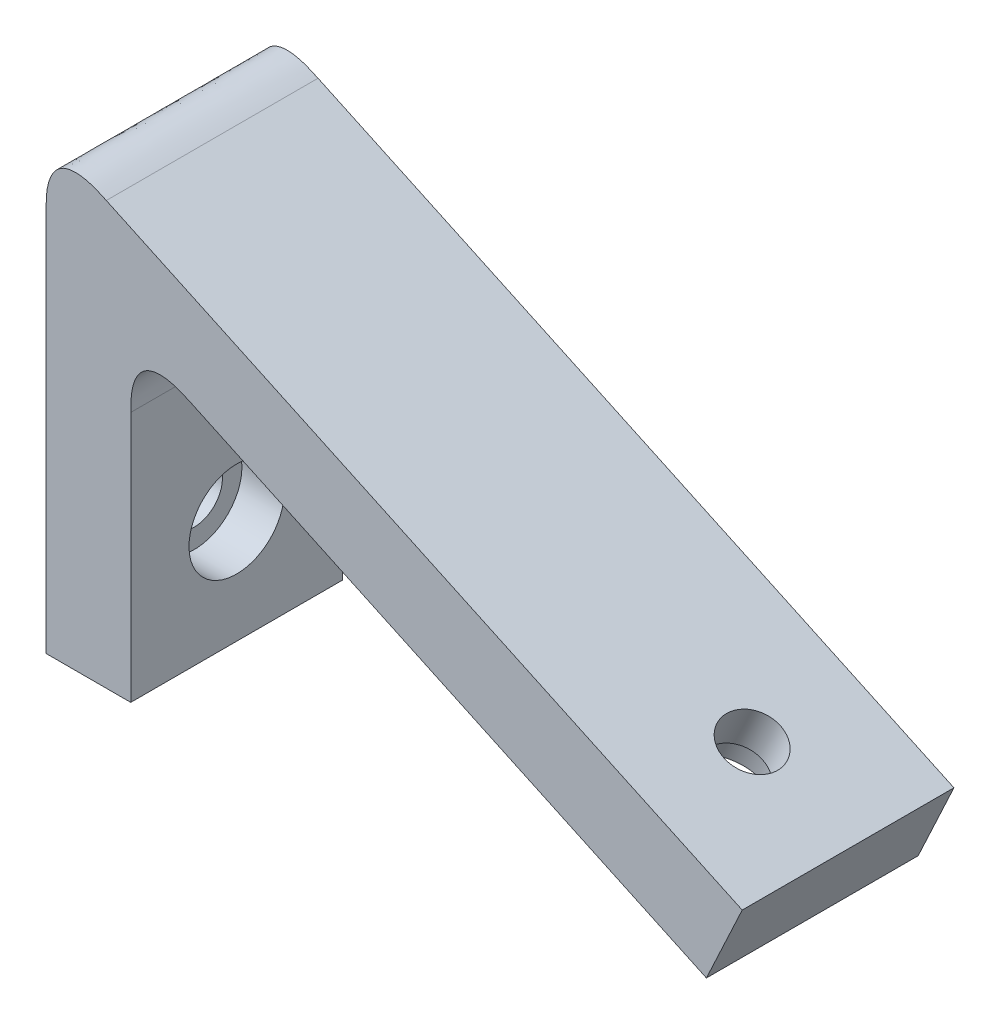
ISO-10303-21;
HEADER;
FILE_DESCRIPTION(('STEP AP214'),'2;1');
FILE_NAME('part.step','',(''),(''),'','','');
FILE_SCHEMA(('AUTOMOTIVE_DESIGN { 1 0 10303 214 1 1 1 1 }'));
ENDSEC;
DATA;
#1=APPLICATION_CONTEXT('core data for automotive mechanical design processes');
#2=APPLICATION_PROTOCOL_DEFINITION('international standard','automotive_design',2000,#1);
#3=PRODUCT_CONTEXT('',#1,'mechanical');
#4=PRODUCT('Part','Part','',(#3));
#5=PRODUCT_RELATED_PRODUCT_CATEGORY('part','',(#4));
#6=PRODUCT_DEFINITION_FORMATION('','',#4);
#7=PRODUCT_DEFINITION_CONTEXT('part definition',#1,'design');
#8=PRODUCT_DEFINITION('design','',#6,#7);
#9=PRODUCT_DEFINITION_SHAPE('','',#8);
#10=(LENGTH_UNIT() NAMED_UNIT(*) SI_UNIT(.MILLI.,.METRE.));
#11=(NAMED_UNIT(*) PLANE_ANGLE_UNIT() SI_UNIT($,.RADIAN.));
#12=(NAMED_UNIT(*) SI_UNIT($,.STERADIAN.) SOLID_ANGLE_UNIT());
#13=UNCERTAINTY_MEASURE_WITH_UNIT(LENGTH_MEASURE(1.E-05),#10,'distance_accuracy_value','');
#14=(GEOMETRIC_REPRESENTATION_CONTEXT(3) GLOBAL_UNCERTAINTY_ASSIGNED_CONTEXT((#13)) GLOBAL_UNIT_ASSIGNED_CONTEXT((#10,
#11,#12)) REPRESENTATION_CONTEXT('',''));
#15=CARTESIAN_POINT('',(0.,0.,0.));
#16=DIRECTION('',(0.,0.,1.));
#17=DIRECTION('',(1.,0.,0.));
#18=AXIS2_PLACEMENT_3D('',#15,#16,#17);
#19=CARTESIAN_POINT('',(0.,12.7,12.7));
#20=DIRECTION('',(-1.,0.,0.));
#21=DIRECTION('',(0.,0.,1.));
#22=AXIS2_PLACEMENT_3D('',#19,#20,#21);
#23=CYLINDRICAL_SURFACE('',#22,3.37819999999999);
#24=CARTESIAN_POINT('',(0.,12.7,12.7));
#25=DIRECTION('',(-1.,0.,0.));
#26=DIRECTION('',(0.,0.,1.));
#27=AXIS2_PLACEMENT_3D('',#24,#25,#26);
#28=CIRCLE('',#27,3.37819999999999);
#29=CARTESIAN_POINT('',(0.,12.7,16.0782));
#30=VERTEX_POINT('',#29);
#31=EDGE_CURVE('E142',#30,#30,#28,.T.);
#32=ORIENTED_EDGE('',*,*,#31,.T.);
#33=EDGE_LOOP('',(#32));
#34=FACE_BOUND('',#33,.T.);
#35=CARTESIAN_POINT('',(5.08,12.7,12.7));
#36=DIRECTION('',(1.,0.,0.));
#37=DIRECTION('',(0.,1.,0.));
#38=AXIS2_PLACEMENT_3D('',#35,#36,#37);
#39=CIRCLE('',#38,3.37819999999999);
#40=CARTESIAN_POINT('',(5.08,16.0782,12.7));
#41=VERTEX_POINT('',#40);
#42=EDGE_CURVE('E51',#41,#41,#39,.F.);
#43=ORIENTED_EDGE('',*,*,#42,.F.);
#44=EDGE_LOOP('',(#43));
#45=FACE_BOUND('',#44,.T.);
#46=ADVANCED_FACE('F43',(#34,#45),#23,.F.);
#47=CARTESIAN_POINT('',(72.0043460161127,20.4718274957577,12.7));
#48=DIRECTION('',(0.422618261740703,0.906307787036648,0.));
#49=DIRECTION('',(-0.906307787036648,0.422618261740703,0.));
#50=AXIS2_PLACEMENT_3D('',#47,#48,#49);
#51=CYLINDRICAL_SURFACE('',#50,3.37819999999999);
#52=CARTESIAN_POINT('',(72.0043460161127,20.4718274957577,12.7));
#53=DIRECTION('',(0.422618261740703,0.906307787036648,0.));
#54=DIRECTION('',(-0.906307787036648,0.422618261740703,0.));
#55=AXIS2_PLACEMENT_3D('',#52,#53,#54);
#56=CIRCLE('',#55,3.37819999999999);
#57=CARTESIAN_POINT('',(68.9426570499455,21.8995165075701,12.7));
#58=VERTEX_POINT('',#57);
#59=EDGE_CURVE('E285',#58,#58,#56,.T.);
#60=ORIENTED_EDGE('',*,*,#59,.T.);
#61=EDGE_LOOP('',(#60));
#62=FACE_BOUND('',#61,.T.);
#63=CARTESIAN_POINT('',(69.85744524647,15.8677839376115,12.7));
#64=DIRECTION('',(-0.422618261740704,-0.906307787036648,0.));
#65=DIRECTION('',(0.906307787036648,-0.422618261740704,0.));
#66=AXIS2_PLACEMENT_3D('',#63,#64,#65);
#67=CIRCLE('',#66,3.37819999999999);
#68=CARTESIAN_POINT('',(72.9191342126372,14.4400949257991,12.7));
#69=VERTEX_POINT('',#68);
#70=EDGE_CURVE('E278',#69,#69,#67,.F.);
#71=ORIENTED_EDGE('',*,*,#70,.F.);
#72=EDGE_LOOP('',(#71));
#73=FACE_BOUND('',#72,.T.);
#74=ADVANCED_FACE('F311',(#62,#73),#51,.F.);
#75=CARTESIAN_POINT('',(0.,0.,25.4));
#76=DIRECTION('',(0.,-1.,0.));
#77=DIRECTION('',(1.,0.,0.));
#78=AXIS2_PLACEMENT_3D('',#75,#76,#77);
#79=PLANE('',#78);
#80=DIRECTION('',(-1.,0.,0.));
#81=VECTOR('',#80,1.);
#82=CARTESIAN_POINT('',(0.,0.,0.));
#83=LINE('',#82,#81);
#84=CARTESIAN_POINT('',(10.16,0.,0.));
#85=VERTEX_POINT('',#84);
#86=CARTESIAN_POINT('',(0.,0.,0.));
#87=VERTEX_POINT('',#86);
#88=EDGE_CURVE('E127',#85,#87,#83,.T.);
#89=ORIENTED_EDGE('',*,*,#88,.F.);
#90=DIRECTION('',(0.,0.,-1.));
#91=VECTOR('',#90,1.);
#92=CARTESIAN_POINT('',(10.16,0.,25.4));
#93=LINE('',#92,#91);
#94=CARTESIAN_POINT('',(10.16,0.,25.4));
#95=VERTEX_POINT('',#94);
#96=EDGE_CURVE('E116',#95,#85,#93,.T.);
#97=ORIENTED_EDGE('',*,*,#96,.F.);
#98=DIRECTION('',(-1.,0.,0.));
#99=VECTOR('',#98,1.);
#100=CARTESIAN_POINT('',(0.,0.,25.4));
#101=LINE('',#100,#99);
#102=CARTESIAN_POINT('',(0.,0.,25.4));
#103=VERTEX_POINT('',#102);
#104=EDGE_CURVE('E120',#95,#103,#101,.T.);
#105=ORIENTED_EDGE('',*,*,#104,.T.);
#106=DIRECTION('',(0.,0.,-1.));
#107=VECTOR('',#106,1.);
#108=CARTESIAN_POINT('',(0.,0.,25.4));
#109=LINE('',#108,#107);
#110=EDGE_CURVE('E365',#103,#87,#109,.T.);
#111=ORIENTED_EDGE('',*,*,#110,.T.);
#112=EDGE_LOOP('',(#89,#97,#105,#111));
#113=FACE_BOUND('',#112,.T.);
#114=ADVANCED_FACE('F124',(#113),#79,.T.);
#115=CARTESIAN_POINT('',(10.16,0.,25.4));
#116=DIRECTION('',(1.,0.,0.));
#117=DIRECTION('',(0.,1.,0.));
#118=AXIS2_PLACEMENT_3D('',#115,#116,#117);
#119=PLANE('',#118);
#120=CARTESIAN_POINT('',(10.16,12.7,12.7));
#121=DIRECTION('',(1.,0.,0.));
#122=DIRECTION('',(0.,1.,0.));
#123=AXIS2_PLACEMENT_3D('',#120,#121,#122);
#124=CIRCLE('',#123,5.715);
#125=CARTESIAN_POINT('',(10.16,18.415,12.7));
#126=VERTEX_POINT('',#125);
#127=EDGE_CURVE('E298',#126,#126,#124,.T.);
#128=ORIENTED_EDGE('',*,*,#127,.F.);
#129=EDGE_LOOP('',(#128));
#130=FACE_BOUND('',#129,.T.);
#131=DIRECTION('',(0.,-1.,0.));
#132=VECTOR('',#131,1.);
#133=CARTESIAN_POINT('',(10.16,0.,0.));
#134=LINE('',#133,#132);
#135=CARTESIAN_POINT('',(10.16,30.1259972682431,0.));
#136=VERTEX_POINT('',#135);
#137=EDGE_CURVE('E322',#136,#85,#134,.T.);
#138=ORIENTED_EDGE('',*,*,#137,.F.);
#139=CARTESIAN_POINT('',(10.16,30.1259972682431,26.67));
#140=CARTESIAN_POINT('',(10.16,30.1259972682431,17.3566666666566));
#141=CARTESIAN_POINT('',(10.16,30.1259972682431,8.04333333333333));
#142=CARTESIAN_POINT('',(10.16,30.1259972682431,-1.27));
#143=B_SPLINE_CURVE_WITH_KNOTS('',3,(#139,#140,#141,#142),.UNSPECIFIED.,.F.,.F.,(4,4),(-0.02667,
0.00127),.UNSPECIFIED.);
#144=CARTESIAN_POINT('',(10.16,30.1259972682431,25.4));
#145=VERTEX_POINT('',#144);
#146=EDGE_CURVE('E70',#136,#145,#143,.F.);
#147=ORIENTED_EDGE('',*,*,#146,.T.);
#148=DIRECTION('',(0.,-1.,0.));
#149=VECTOR('',#148,1.);
#150=CARTESIAN_POINT('',(10.16,0.,25.4));
#151=LINE('',#150,#149);
#152=EDGE_CURVE('E113',#145,#95,#151,.T.);
#153=ORIENTED_EDGE('',*,*,#152,.T.);
#154=ORIENTED_EDGE('',*,*,#96,.T.);
#155=EDGE_LOOP('',(#138,#147,#153,#154));
#156=FACE_BOUND('',#155,.T.);
#157=ADVANCED_FACE('F115',(#130,#156),#119,.T.);
#158=CARTESIAN_POINT('',(16.4077855842091,35.1866097355729,25.4));
#159=DIRECTION('',(-0.422618261740704,-0.906307787036648,0.));
#160=DIRECTION('',(0.906307787036648,-0.422618261740704,0.));
#161=AXIS2_PLACEMENT_3D('',#158,#159,#160);
#162=PLANE('',#161);
#163=CARTESIAN_POINT('',(67.7105444768272,11.2637403794653,12.7));
#164=DIRECTION('',(-0.422618261740704,-0.906307787036648,0.));
#165=DIRECTION('',(0.906307787036648,-0.422618261740704,0.));
#166=AXIS2_PLACEMENT_3D('',#163,#164,#165);
#167=CIRCLE('',#166,5.715);
#168=CARTESIAN_POINT('',(72.8900934797416,8.84847701361721,12.7));
#169=VERTEX_POINT('',#168);
#170=EDGE_CURVE('E291',#169,#169,#167,.T.);
#171=ORIENTED_EDGE('',*,*,#170,.F.);
#172=EDGE_LOOP('',(#171));
#173=FACE_BOUND('',#172,.T.);
#174=DIRECTION('',(-0.906307787036648,0.422618261740704,0.));
#175=VECTOR('',#174,1.);
#176=CARTESIAN_POINT('',(16.4077855842091,35.1866097355729,25.4));
#177=LINE('',#176,#175);
#178=CARTESIAN_POINT('',(79.2206533721926,5.89648845535838,25.4));
#179=VERTEX_POINT('',#178);
#180=CARTESIAN_POINT('',(17.3869007696428,34.7300408263893,25.4));
#181=VERTEX_POINT('',#180);
#182=EDGE_CURVE('E119',#179,#181,#177,.T.);
#183=ORIENTED_EDGE('',*,*,#182,.T.);
#184=CARTESIAN_POINT('',(17.3869007696428,34.7300408263893,-1.27));
#185=CARTESIAN_POINT('',(17.3869007696428,34.7300408263893,8.04333333333333));
#186=CARTESIAN_POINT('',(17.3869007696428,34.7300408263893,17.3566666666566));
#187=CARTESIAN_POINT('',(17.3869007696428,34.7300408263893,26.67));
#188=B_SPLINE_CURVE_WITH_KNOTS('',3,(#184,#185,#186,#187),.UNSPECIFIED.,.F.,.F.,(4,4),(-0.02667,
0.00127),.UNSPECIFIED.);
#189=CARTESIAN_POINT('',(17.3869007696428,34.7300408263893,0.));
#190=VERTEX_POINT('',#189);
#191=EDGE_CURVE('E257',#181,#190,#188,.F.);
#192=ORIENTED_EDGE('',*,*,#191,.T.);
#193=DIRECTION('',(-0.906307787036648,0.422618261740704,0.));
#194=VECTOR('',#193,1.);
#195=CARTESIAN_POINT('',(16.4077855842091,35.1866097355729,0.));
#196=LINE('',#195,#194);
#197=CARTESIAN_POINT('',(79.2206533721926,5.89648845535838,0.));
#198=VERTEX_POINT('',#197);
#199=EDGE_CURVE('E326',#198,#190,#196,.T.);
#200=ORIENTED_EDGE('',*,*,#199,.F.);
#201=DIRECTION('',(0.,0.,-1.));
#202=VECTOR('',#201,1.);
#203=CARTESIAN_POINT('',(79.2206533721926,5.89648845535838,25.4));
#204=LINE('',#203,#202);
#205=EDGE_CURVE('E129',#179,#198,#204,.T.);
#206=ORIENTED_EDGE('',*,*,#205,.F.);
#207=EDGE_LOOP('',(#183,#192,#200,#206));
#208=FACE_BOUND('',#207,.T.);
#209=ADVANCED_FACE('F361',(#173,#208),#162,.T.);
#210=CARTESIAN_POINT('',(62.8128677879834,-29.2901212802145,25.4));
#211=DIRECTION('',(0.906307787036647,-0.422618261740705,0.));
#212=DIRECTION('',(0.422618261740705,0.906307787036648,0.));
#213=AXIS2_PLACEMENT_3D('',#210,#211,#212);
#214=PLANE('',#213);
#215=DIRECTION('',(-0.422618261740705,-0.906307787036648,0.));
#216=VECTOR('',#215,1.);
#217=CARTESIAN_POINT('',(62.8128677879834,-29.2901212802145,0.));
#218=LINE('',#217,#216);
#219=CARTESIAN_POINT('',(83.5144549114781,15.1045755716507,0.));
#220=VERTEX_POINT('',#219);
#221=EDGE_CURVE('E421',#220,#198,#218,.T.);
#222=ORIENTED_EDGE('',*,*,#221,.F.);
#223=DIRECTION('',(0.,0.,-1.));
#224=VECTOR('',#223,1.);
#225=CARTESIAN_POINT('',(83.5144549114781,15.1045755716507,25.4));
#226=LINE('',#225,#224);
#227=CARTESIAN_POINT('',(83.5144549114781,15.1045755716507,25.4));
#228=VERTEX_POINT('',#227);
#229=EDGE_CURVE('E359',#228,#220,#226,.T.);
#230=ORIENTED_EDGE('',*,*,#229,.F.);
#231=DIRECTION('',(-0.422618261740705,-0.906307787036648,0.));
#232=VECTOR('',#231,1.);
#233=CARTESIAN_POINT('',(62.8128677879834,-29.2901212802145,25.4));
#234=LINE('',#233,#232);
#235=EDGE_CURVE('E155',#228,#179,#234,.T.);
#236=ORIENTED_EDGE('',*,*,#235,.T.);
#237=ORIENTED_EDGE('',*,*,#205,.T.);
#238=EDGE_LOOP('',(#222,#230,#236,#237));
#239=FACE_BOUND('',#238,.T.);
#240=ADVANCED_FACE('F356',(#239),#214,.T.);
#241=CARTESIAN_POINT('',(20.7015871234946,44.3946968518652,25.4));
#242=DIRECTION('',(0.422618261740703,0.906307787036648,0.));
#243=DIRECTION('',(-0.906307787036648,0.422618261740703,0.));
#244=AXIS2_PLACEMENT_3D('',#241,#242,#243);
#245=PLANE('',#244);
#246=ORIENTED_EDGE('',*,*,#59,.F.);
#247=EDGE_LOOP('',(#246));
#248=FACE_BOUND('',#247,.T.);
#249=DIRECTION('',(0.906307787036648,-0.422618261740703,0.));
#250=VECTOR('',#249,1.);
#251=CARTESIAN_POINT('',(20.7015871234946,44.3946968518652,0.));
#252=LINE('',#251,#250);
#253=CARTESIAN_POINT('',(7.22690076964278,50.678046289903,0.));
#254=VERTEX_POINT('',#253);
#255=EDGE_CURVE('E138',#254,#220,#252,.T.);
#256=ORIENTED_EDGE('',*,*,#255,.F.);
#257=CARTESIAN_POINT('',(7.22690076964277,50.678046289903,26.67));
#258=CARTESIAN_POINT('',(7.22690076964277,50.678046289903,17.3566666666566));
#259=CARTESIAN_POINT('',(7.22690076964277,50.678046289903,8.04333333333334));
#260=CARTESIAN_POINT('',(7.22690076964277,50.678046289903,-1.26999999999999));
#261=B_SPLINE_CURVE_WITH_KNOTS('',3,(#257,#258,#259,#260),.UNSPECIFIED.,.F.,.F.,(4,4),(-0.00127,
0.02667),.UNSPECIFIED.);
#262=CARTESIAN_POINT('',(7.22690076964276,50.678046289903,25.4));
#263=VERTEX_POINT('',#262);
#264=EDGE_CURVE('E236',#254,#263,#261,.F.);
#265=ORIENTED_EDGE('',*,*,#264,.T.);
#266=DIRECTION('',(0.906307787036648,-0.422618261740703,0.));
#267=VECTOR('',#266,1.);
#268=CARTESIAN_POINT('',(20.7015871234946,44.3946968518652,25.4));
#269=LINE('',#268,#267);
#270=EDGE_CURVE('E344',#263,#228,#269,.T.);
#271=ORIENTED_EDGE('',*,*,#270,.T.);
#272=ORIENTED_EDGE('',*,*,#229,.T.);
#273=EDGE_LOOP('',(#256,#265,#271,#272));
#274=FACE_BOUND('',#273,.T.);
#275=ADVANCED_FACE('F407',(#248,#274),#245,.T.);
#276=CARTESIAN_POINT('',(0.,0.,25.4));
#277=DIRECTION('',(-1.,0.,0.));
#278=DIRECTION('',(0.,0.,1.));
#279=AXIS2_PLACEMENT_3D('',#276,#277,#278);
#280=PLANE('',#279);
#281=ORIENTED_EDGE('',*,*,#31,.F.);
#282=EDGE_LOOP('',(#281));
#283=FACE_BOUND('',#282,.T.);
#284=DIRECTION('',(0.,1.,0.));
#285=VECTOR('',#284,1.);
#286=CARTESIAN_POINT('',(0.,0.,25.4));
#287=LINE('',#286,#285);
#288=CARTESIAN_POINT('',(0.,46.0740027317568,25.4));
#289=VERTEX_POINT('',#288);
#290=EDGE_CURVE('E134',#103,#289,#287,.T.);
#291=ORIENTED_EDGE('',*,*,#290,.T.);
#292=CARTESIAN_POINT('',(0.,46.0740027317568,-1.26999999999999));
#293=CARTESIAN_POINT('',(0.,46.0740027317568,8.04333333333334));
#294=CARTESIAN_POINT('',(0.,46.0740027317568,17.3566666666566));
#295=CARTESIAN_POINT('',(0.,46.0740027317568,26.67));
#296=B_SPLINE_CURVE_WITH_KNOTS('',3,(#292,#293,#294,#295),.UNSPECIFIED.,.F.,.F.,(4,4),(-0.00127,
0.02667),.UNSPECIFIED.);
#297=CARTESIAN_POINT('',(0.,46.0740027317568,0.));
#298=VERTEX_POINT('',#297);
#299=EDGE_CURVE('E128',#289,#298,#296,.F.);
#300=ORIENTED_EDGE('',*,*,#299,.T.);
#301=DIRECTION('',(0.,1.,0.));
#302=VECTOR('',#301,1.);
#303=CARTESIAN_POINT('',(0.,0.,0.));
#304=LINE('',#303,#302);
#305=EDGE_CURVE('E135',#87,#298,#304,.T.);
#306=ORIENTED_EDGE('',*,*,#305,.F.);
#307=ORIENTED_EDGE('',*,*,#110,.F.);
#308=EDGE_LOOP('',(#291,#300,#306,#307));
#309=FACE_BOUND('',#308,.T.);
#310=ADVANCED_FACE('F175',(#283,#309),#280,.T.);
#311=CARTESIAN_POINT('',(0.,0.,25.4));
#312=DIRECTION('',(0.,0.,1.));
#313=DIRECTION('',(1.,0.,0.));
#314=AXIS2_PLACEMENT_3D('',#311,#312,#313);
#315=PLANE('',#314);
#316=ORIENTED_EDGE('',*,*,#270,.F.);
#317=CARTESIAN_POINT('',(0.,46.0740027317568,25.4));
#318=CARTESIAN_POINT('',(0.,47.2991242097529,25.4));
#319=CARTESIAN_POINT('',(0.,48.5242456877489,25.4));
#320=CARTESIAN_POINT('',(0.681775823432991,51.1365785280553,25.4));
#321=CARTESIAN_POINT('',(2.35051798959814,52.1996845350746,25.4));
#322=CARTESIAN_POINT('',(5.00622649849544,51.7135637088068,25.4));
#323=CARTESIAN_POINT('',(6.11656363406911,51.1958049993549,25.4));
#324=CARTESIAN_POINT('',(7.22690076964277,50.678046289903,25.4));
#325=B_SPLINE_CURVE_WITH_KNOTS('',5,(#317,#318,#319,#320,#321,#322,#323,#324),.UNSPECIFIED.,.F.,
.F.,(6,2,6),(0.,0.5,1.),.UNSPECIFIED.);
#326=EDGE_CURVE('E158',#263,#289,#325,.F.);
#327=ORIENTED_EDGE('',*,*,#326,.T.);
#328=ORIENTED_EDGE('',*,*,#290,.F.);
#329=ORIENTED_EDGE('',*,*,#104,.F.);
#330=ORIENTED_EDGE('',*,*,#152,.F.);
#331=CARTESIAN_POINT('',(17.3869007696428,34.7300408263893,25.4));
#332=CARTESIAN_POINT('',(16.2765636340691,35.2477995358412,25.4));
#333=CARTESIAN_POINT('',(15.1662264984954,35.7655582452931,25.4));
#334=CARTESIAN_POINT('',(12.5105179895981,36.2516790715608,25.4));
#335=CARTESIAN_POINT('',(10.841775823433,35.1885730645416,25.4));
#336=CARTESIAN_POINT('',(10.16,32.5762402242352,25.4));
#337=CARTESIAN_POINT('',(10.16,31.3511187462392,25.4));
#338=CARTESIAN_POINT('',(10.16,30.1259972682431,25.4));
#339=B_SPLINE_CURVE_WITH_KNOTS('',5,(#331,#332,#333,#334,#335,#336,#337,#338),.UNSPECIFIED.,.F.,
.F.,(6,2,6),(0.,0.5,1.),.UNSPECIFIED.);
#340=EDGE_CURVE('E11',#145,#181,#339,.F.);
#341=ORIENTED_EDGE('',*,*,#340,.T.);
#342=ORIENTED_EDGE('',*,*,#182,.F.);
#343=ORIENTED_EDGE('',*,*,#235,.F.);
#344=EDGE_LOOP('',(#316,#327,#328,#329,#330,#341,#342,#343));
#345=FACE_BOUND('',#344,.T.);
#346=ADVANCED_FACE('F132',(#345),#315,.T.);
#347=CARTESIAN_POINT('',(0.,0.,0.));
#348=DIRECTION('',(0.,0.,1.));
#349=DIRECTION('',(1.,0.,0.));
#350=AXIS2_PLACEMENT_3D('',#347,#348,#349);
#351=PLANE('',#350);
#352=ORIENTED_EDGE('',*,*,#305,.T.);
#353=CARTESIAN_POINT('',(7.22690076964277,50.678046289903,0.));
#354=CARTESIAN_POINT('',(6.11656363406911,51.1958049993549,0.));
#355=CARTESIAN_POINT('',(5.00622649849544,51.7135637088068,0.));
#356=CARTESIAN_POINT('',(2.35051798959814,52.1996845350746,0.));
#357=CARTESIAN_POINT('',(0.681775823432991,51.1365785280553,0.));
#358=CARTESIAN_POINT('',(0.,48.5242456877489,0.));
#359=CARTESIAN_POINT('',(0.,47.2991242097529,0.));
#360=CARTESIAN_POINT('',(0.,46.0740027317568,0.));
#361=B_SPLINE_CURVE_WITH_KNOTS('',5,(#353,#354,#355,#356,#357,#358,#359,#360),.UNSPECIFIED.,.F.,
.F.,(6,2,6),(0.,0.5,1.),.UNSPECIFIED.);
#362=EDGE_CURVE('E194',#298,#254,#361,.F.);
#363=ORIENTED_EDGE('',*,*,#362,.T.);
#364=ORIENTED_EDGE('',*,*,#255,.T.);
#365=ORIENTED_EDGE('',*,*,#221,.T.);
#366=ORIENTED_EDGE('',*,*,#199,.T.);
#367=CARTESIAN_POINT('',(10.16,30.1259972682431,0.));
#368=CARTESIAN_POINT('',(10.16,31.3511187462392,0.));
#369=CARTESIAN_POINT('',(10.16,32.5762402242352,0.));
#370=CARTESIAN_POINT('',(10.841775823433,35.1885730645415,0.));
#371=CARTESIAN_POINT('',(12.5105179895981,36.2516790715608,0.));
#372=CARTESIAN_POINT('',(15.1662264984954,35.7655582452931,0.));
#373=CARTESIAN_POINT('',(16.2765636340691,35.2477995358412,0.));
#374=CARTESIAN_POINT('',(17.3869007696428,34.7300408263893,0.));
#375=B_SPLINE_CURVE_WITH_KNOTS('',5,(#367,#368,#369,#370,#371,#372,#373,#374),.UNSPECIFIED.,.F.,
.F.,(6,2,6),(0.,0.5,1.),.UNSPECIFIED.);
#376=EDGE_CURVE('E56',#190,#136,#375,.F.);
#377=ORIENTED_EDGE('',*,*,#376,.T.);
#378=ORIENTED_EDGE('',*,*,#137,.T.);
#379=ORIENTED_EDGE('',*,*,#88,.T.);
#380=EDGE_LOOP('',(#352,#363,#364,#365,#366,#377,#378,#379));
#381=FACE_BOUND('',#380,.T.);
#382=ADVANCED_FACE('F174',(#381),#351,.F.);
#383=CARTESIAN_POINT('',(0.,46.0740027317568,26.67));
#384=CARTESIAN_POINT('',(0.,46.0740027317568,17.3566666666566));
#385=CARTESIAN_POINT('',(0.,46.0740027317568,8.04333333333334));
#386=CARTESIAN_POINT('',(0.,46.0740027317568,-1.26999999999999));
#387=CARTESIAN_POINT('',(0.,47.2991242097529,26.67));
#388=CARTESIAN_POINT('',(0.,47.2991242097529,17.3566666666566));
#389=CARTESIAN_POINT('',(0.,47.2991242097529,8.04333333333334));
#390=CARTESIAN_POINT('',(0.,47.2991242097529,-1.26999999999999));
#391=CARTESIAN_POINT('',(0.,48.5242456877489,26.67));
#392=CARTESIAN_POINT('',(0.,48.5242456877489,17.3566666666566));
#393=CARTESIAN_POINT('',(0.,48.524245687749,8.04333333333334));
#394=CARTESIAN_POINT('',(0.,48.5242456877489,-1.26999999999999));
#395=CARTESIAN_POINT('',(0.681775823432991,51.1365785280553,26.67));
#396=CARTESIAN_POINT('',(0.681775823432991,51.1365785280553,17.3566666666566));
#397=CARTESIAN_POINT('',(0.681775823432991,51.1365785280553,8.04333333333334));
#398=CARTESIAN_POINT('',(0.681775823432991,51.1365785280553,-1.26999999999999));
#399=CARTESIAN_POINT('',(2.35051798959814,52.1996845350746,26.67));
#400=CARTESIAN_POINT('',(2.35051798959814,52.1996845350746,17.3566666666566));
#401=CARTESIAN_POINT('',(2.35051798959814,52.1996845350746,8.04333333333334));
#402=CARTESIAN_POINT('',(2.35051798959814,52.1996845350746,-1.26999999999999));
#403=CARTESIAN_POINT('',(5.00622649849544,51.7135637088068,26.67));
#404=CARTESIAN_POINT('',(5.00622649849544,51.7135637088068,17.3566666666566));
#405=CARTESIAN_POINT('',(5.00622649849544,51.7135637088068,8.04333333333334));
#406=CARTESIAN_POINT('',(5.00622649849544,51.7135637088068,-1.26999999999999));
#407=CARTESIAN_POINT('',(6.11656363406911,51.1958049993549,26.67));
#408=CARTESIAN_POINT('',(6.11656363406911,51.1958049993549,17.3566666666566));
#409=CARTESIAN_POINT('',(6.11656363406911,51.1958049993549,8.04333333333334));
#410=CARTESIAN_POINT('',(6.11656363406911,51.1958049993549,-1.26999999999999));
#411=CARTESIAN_POINT('',(7.22690076964277,50.678046289903,26.67));
#412=CARTESIAN_POINT('',(7.22690076964277,50.678046289903,17.3566666666566));
#413=CARTESIAN_POINT('',(7.22690076964277,50.678046289903,8.04333333333334));
#414=CARTESIAN_POINT('',(7.22690076964277,50.678046289903,-1.26999999999999));
#415=B_SPLINE_SURFACE_WITH_KNOTS('',5,3,((#383,#384,#385,#386),(#387,#388,#389,#390),(#391,#392,
#393,#394),(#395,#396,#397,#398),(#399,#400,#401,#402),(#403,#404,#405,#406),(#407,#408,#409,
#410),(#411,#412,#413,#414)),.UNSPECIFIED.,.F.,.F.,.F.,(6,2,6),(4,4),(0.,0.5,1.),(-0.00127,
0.02667),.UNSPECIFIED.);
#416=ORIENTED_EDGE('',*,*,#326,.F.);
#417=ORIENTED_EDGE('',*,*,#264,.F.);
#418=ORIENTED_EDGE('',*,*,#362,.F.);
#419=ORIENTED_EDGE('',*,*,#299,.F.);
#420=EDGE_LOOP('',(#416,#417,#418,#419));
#421=FACE_BOUND('',#420,.T.);
#422=ADVANCED_FACE('F201',(#421),#415,.T.);
#423=CARTESIAN_POINT('',(10.16,30.1259972682431,-1.27));
#424=CARTESIAN_POINT('',(10.16,30.1259972682431,8.04333333333333));
#425=CARTESIAN_POINT('',(10.16,30.1259972682431,17.3566666666566));
#426=CARTESIAN_POINT('',(10.16,30.1259972682431,26.67));
#427=CARTESIAN_POINT('',(10.16,31.3511187462392,-1.27));
#428=CARTESIAN_POINT('',(10.16,31.3511187462392,8.04333333333333));
#429=CARTESIAN_POINT('',(10.16,31.3511187462392,17.3566666666566));
#430=CARTESIAN_POINT('',(10.16,31.3511187462392,26.67));
#431=CARTESIAN_POINT('',(10.16,32.5762402242352,-1.27));
#432=CARTESIAN_POINT('',(10.16,32.5762402242352,8.04333333333333));
#433=CARTESIAN_POINT('',(10.16,32.5762402242352,17.3566666666566));
#434=CARTESIAN_POINT('',(10.16,32.5762402242352,26.67));
#435=CARTESIAN_POINT('',(10.841775823433,35.1885730645416,-1.27));
#436=CARTESIAN_POINT('',(10.841775823433,35.1885730645416,8.04333333333333));
#437=CARTESIAN_POINT('',(10.841775823433,35.1885730645416,17.3566666666566));
#438=CARTESIAN_POINT('',(10.841775823433,35.1885730645416,26.67));
#439=CARTESIAN_POINT('',(12.5105179895981,36.2516790715608,-1.27));
#440=CARTESIAN_POINT('',(12.5105179895981,36.2516790715608,8.04333333333333));
#441=CARTESIAN_POINT('',(12.5105179895981,36.2516790715608,17.3566666666566));
#442=CARTESIAN_POINT('',(12.5105179895981,36.2516790715608,26.67));
#443=CARTESIAN_POINT('',(15.1662264984954,35.7655582452931,-1.27));
#444=CARTESIAN_POINT('',(15.1662264984954,35.7655582452931,8.04333333333333));
#445=CARTESIAN_POINT('',(15.1662264984954,35.7655582452931,17.3566666666566));
#446=CARTESIAN_POINT('',(15.1662264984954,35.7655582452931,26.67));
#447=CARTESIAN_POINT('',(16.2765636340691,35.2477995358412,-1.27));
#448=CARTESIAN_POINT('',(16.2765636340691,35.2477995358412,8.04333333333333));
#449=CARTESIAN_POINT('',(16.2765636340691,35.2477995358412,17.3566666666566));
#450=CARTESIAN_POINT('',(16.2765636340691,35.2477995358412,26.67));
#451=CARTESIAN_POINT('',(17.3869007696428,34.7300408263893,-1.27));
#452=CARTESIAN_POINT('',(17.3869007696428,34.7300408263893,8.04333333333333));
#453=CARTESIAN_POINT('',(17.3869007696428,34.7300408263893,17.3566666666566));
#454=CARTESIAN_POINT('',(17.3869007696428,34.7300408263893,26.67));
#455=B_SPLINE_SURFACE_WITH_KNOTS('',5,3,((#423,#424,#425,#426),(#427,#428,#429,#430),(#431,#432,
#433,#434),(#435,#436,#437,#438),(#439,#440,#441,#442),(#443,#444,#445,#446),(#447,#448,#449,
#450),(#451,#452,#453,#454)),.UNSPECIFIED.,.F.,.F.,.F.,(6,2,6),(4,4),(0.,0.5,1.),(-0.02667,
0.00127),.UNSPECIFIED.);
#456=ORIENTED_EDGE('',*,*,#340,.F.);
#457=ORIENTED_EDGE('',*,*,#146,.F.);
#458=ORIENTED_EDGE('',*,*,#376,.F.);
#459=ORIENTED_EDGE('',*,*,#191,.F.);
#460=EDGE_LOOP('',(#456,#457,#458,#459));
#461=FACE_BOUND('',#460,.T.);
#462=ADVANCED_FACE('F46',(#461),#455,.T.);
#463=CARTESIAN_POINT('',(69.85744524647,15.8677839376115,12.7));
#464=DIRECTION('',(-0.422618261740704,-0.906307787036648,0.));
#465=DIRECTION('',(0.906307787036648,-0.422618261740704,0.));
#466=AXIS2_PLACEMENT_3D('',#463,#464,#465);
#467=PLANE('',#466);
#468=CARTESIAN_POINT('',(69.85744524647,15.8677839376115,12.7));
#469=DIRECTION('',(-0.422618261740704,-0.906307787036648,0.));
#470=DIRECTION('',(0.906307787036648,-0.422618261740704,0.));
#471=AXIS2_PLACEMENT_3D('',#468,#469,#470);
#472=CIRCLE('',#471,5.715);
#473=CARTESIAN_POINT('',(75.0369942493844,13.4525205717634,12.7));
#474=VERTEX_POINT('',#473);
#475=EDGE_CURVE('E286',#474,#474,#472,.T.);
#476=ORIENTED_EDGE('',*,*,#475,.T.);
#477=EDGE_LOOP('',(#476));
#478=FACE_BOUND('',#477,.T.);
#479=ORIENTED_EDGE('',*,*,#70,.T.);
#480=EDGE_LOOP('',(#479));
#481=FACE_BOUND('',#480,.T.);
#482=ADVANCED_FACE('F448',(#478,#481),#467,.T.);
#483=CARTESIAN_POINT('',(69.85744524647,15.8677839376115,12.7));
#484=DIRECTION('',(-0.422618261740704,-0.906307787036648,0.));
#485=DIRECTION('',(0.906307787036648,-0.422618261740704,0.));
#486=AXIS2_PLACEMENT_3D('',#483,#484,#485);
#487=CYLINDRICAL_SURFACE('',#486,5.715);
#488=CARTESIAN_POINT('',(75.0369942493844,13.4525205717634,12.7));
#489=CARTESIAN_POINT('',(75.0146306997006,13.4045617846994,12.7));
#490=CARTESIAN_POINT('',(74.9922671500168,13.3566029976353,12.7));
#491=CARTESIAN_POINT('',(74.9475400506493,13.2606854235073,12.7));
#492=CARTESIAN_POINT('',(74.9251765009655,13.2127266364433,12.7));
#493=CARTESIAN_POINT('',(74.8804494015979,13.1168090623152,12.7));
#494=CARTESIAN_POINT('',(74.8580858519142,13.0688502752512,12.7));
#495=CARTESIAN_POINT('',(74.8133587525466,12.9729327011232,12.7));
#496=CARTESIAN_POINT('',(74.7909952028628,12.9249739140591,12.7));
#497=CARTESIAN_POINT('',(74.7462681034953,12.8290563399311,12.7));
#498=CARTESIAN_POINT('',(74.7239045538115,12.7810975528671,12.7));
#499=CARTESIAN_POINT('',(74.6791774544439,12.685179978739,12.7));
#500=CARTESIAN_POINT('',(74.6568139047601,12.637221191675,12.7));
#501=CARTESIAN_POINT('',(74.6120868053926,12.541303617547,12.7));
#502=CARTESIAN_POINT('',(74.5897232557088,12.4933448304829,12.7));
#503=CARTESIAN_POINT('',(74.5449961563412,12.3974272563549,12.7));
#504=CARTESIAN_POINT('',(74.5226326066575,12.3494684692909,12.7));
#505=CARTESIAN_POINT('',(74.4779055072899,12.2535508951628,12.7));
#506=CARTESIAN_POINT('',(74.4555419576061,12.2055921080988,12.7));
#507=CARTESIAN_POINT('',(74.4108148582386,12.1096745339707,12.7));
#508=CARTESIAN_POINT('',(74.3884513085548,12.0617157469067,12.7));
#509=CARTESIAN_POINT('',(74.3437242091872,11.9657981727787,12.7));
#510=CARTESIAN_POINT('',(74.3213606595035,11.9178393857147,12.7));
#511=CARTESIAN_POINT('',(74.2766335601359,11.8219218115866,12.7));
#512=CARTESIAN_POINT('',(74.2542700104521,11.7739630245226,12.7));
#513=CARTESIAN_POINT('',(74.2095429110846,11.6780454503945,12.7));
#514=CARTESIAN_POINT('',(74.1871793614008,11.6300866633305,12.7));
#515=CARTESIAN_POINT('',(74.1424522620332,11.5341690892025,12.7));
#516=CARTESIAN_POINT('',(74.1200887123495,11.4862103021385,12.7));
#517=CARTESIAN_POINT('',(74.0753616129819,11.3902927280104,12.7));
#518=CARTESIAN_POINT('',(74.0529980632981,11.3423339409464,12.7));
#519=CARTESIAN_POINT('',(74.0082709639305,11.2464163668183,12.7));
#520=CARTESIAN_POINT('',(73.9859074142468,11.1984575797543,12.7));
#521=CARTESIAN_POINT('',(73.9411803148792,11.1025400056263,12.7));
#522=CARTESIAN_POINT('',(73.9188167651954,11.0545812185622,12.7));
#523=CARTESIAN_POINT('',(73.8740896658279,10.9586636444342,12.7));
#524=CARTESIAN_POINT('',(73.8517261161441,10.9107048573702,12.7));
#525=CARTESIAN_POINT('',(73.8069990167765,10.8147872832421,12.7));
#526=CARTESIAN_POINT('',(73.7846354670928,10.7668284961781,12.7));
#527=CARTESIAN_POINT('',(73.7399083677252,10.6709109220501,12.7));
#528=CARTESIAN_POINT('',(73.7175448180414,10.622952134986,12.7));
#529=CARTESIAN_POINT('',(73.6728177186739,10.527034560858,12.7));
#530=CARTESIAN_POINT('',(73.6504541689901,10.479075773794,12.7));
#531=CARTESIAN_POINT('',(73.6057270696225,10.3831581996659,12.7));
#532=CARTESIAN_POINT('',(73.5833635199388,10.3351994126019,12.7));
#533=CARTESIAN_POINT('',(73.5386364205712,10.2392818384739,12.7));
#534=CARTESIAN_POINT('',(73.5162728708874,10.1913230514098,12.7));
#535=CARTESIAN_POINT('',(73.4715457715199,10.0954054772818,12.7));
#536=CARTESIAN_POINT('',(73.4491822218361,10.0474466902178,12.7));
#537=CARTESIAN_POINT('',(73.4044551224685,9.95152911608973,12.7));
#538=CARTESIAN_POINT('',(73.3820915727847,9.90357032902571,12.7));
#539=CARTESIAN_POINT('',(73.3373644734172,9.80765275489766,12.7));
#540=CARTESIAN_POINT('',(73.3150009237334,9.75969396783364,12.7));
#541=CARTESIAN_POINT('',(73.2702738243658,9.66377639370559,12.7));
#542=CARTESIAN_POINT('',(73.2479102746821,9.61581760664157,12.7));
#543=CARTESIAN_POINT('',(73.2031831753145,9.51990003251352,12.7));
#544=CARTESIAN_POINT('',(73.1808196256307,9.4719412454495,12.7));
#545=CARTESIAN_POINT('',(73.1360925262632,9.37602367132146,12.7));
#546=CARTESIAN_POINT('',(73.1137289765794,9.32806488425743,12.7));
#547=CARTESIAN_POINT('',(73.0690018772118,9.23214731012939,12.7));
#548=CARTESIAN_POINT('',(73.0466383275281,9.18418852306537,12.7));
#549=CARTESIAN_POINT('',(73.0019112281605,9.08827094893732,12.7));
#550=CARTESIAN_POINT('',(72.9795476784767,9.0403121618733,12.7));
#551=CARTESIAN_POINT('',(72.9348205791092,8.94439458774526,12.7));
#552=CARTESIAN_POINT('',(72.9124570294254,8.89643580068123,12.7));
#553=CARTESIAN_POINT('',(72.8900934797416,8.84847701361721,12.7));
#554=B_SPLINE_CURVE_WITH_KNOTS('',3,(#488,#489,#490,#491,#492,#493,#494,#495,#496,#497,#498,
#499,#500,#501,#502,#503,#504,#505,#506,#507,#508,#509,#510,#511,#512,#513,#514,#515,#516,#517,
#518,#519,#520,#521,#522,#523,#524,#525,#526,#527,#528,#529,#530,#531,#532,#533,#534,#535,#536,
#537,#538,#539,#540,#541,#542,#543,#544,#545,#546,#547,#548,#549,#550,#551,#552,#553),
.UNSPECIFIED.,.F.,.F.,(4,2,2,2,2,2,2,2,2,2,2,2,2,2,2,2,2,2,2,2,2,2,2,2,2,2,2,2,2,2,2,2,4),(0.,
0.158749999999997,0.317500000000001,0.476249999999999,0.634999999999998,0.793749999999996,
0.9525,1.11125,1.27,1.42875,1.5875,1.74625,1.905,2.06375,2.2225,2.38125,2.54,2.69875,2.8575,
3.01625,3.175,3.33374999999999,3.4925,3.65125,3.81,3.96875,4.1275,4.28624999999999,4.445,
4.60375,4.76249999999999,4.92125,5.08),.UNSPECIFIED.);
#555=EDGE_CURVE('BSEAM467',#474,#169,#554,.T.);
#556=ORIENTED_EDGE('',*,*,#475,.F.);
#557=ORIENTED_EDGE('',*,*,#170,.T.);
#558=ORIENTED_EDGE('',*,*,#555,.T.);
#559=ORIENTED_EDGE('',*,*,#555,.F.);
#560=EDGE_LOOP('',(#556,#558,#557,#559));
#561=FACE_BOUND('',#560,.T.);
#562=ADVANCED_FACE('F467',(#561),#487,.F.);
#563=CARTESIAN_POINT('',(5.08,12.7,12.7));
#564=DIRECTION('',(1.,0.,0.));
#565=DIRECTION('',(0.,1.,0.));
#566=AXIS2_PLACEMENT_3D('',#563,#564,#565);
#567=PLANE('',#566);
#568=CARTESIAN_POINT('',(5.08,12.7,12.7));
#569=DIRECTION('',(1.,0.,0.));
#570=DIRECTION('',(0.,1.,0.));
#571=AXIS2_PLACEMENT_3D('',#568,#569,#570);
#572=CIRCLE('',#571,5.715);
#573=CARTESIAN_POINT('',(5.08,18.415,12.7));
#574=VERTEX_POINT('',#573);
#575=EDGE_CURVE('E301',#574,#574,#572,.T.);
#576=ORIENTED_EDGE('',*,*,#575,.T.);
#577=EDGE_LOOP('',(#576));
#578=FACE_BOUND('',#577,.T.);
#579=ORIENTED_EDGE('',*,*,#42,.T.);
#580=EDGE_LOOP('',(#579));
#581=FACE_BOUND('',#580,.T.);
#582=ADVANCED_FACE('F308',(#578,#581),#567,.T.);
#583=CARTESIAN_POINT('',(5.08,12.7,12.7));
#584=DIRECTION('',(1.,0.,0.));
#585=DIRECTION('',(0.,1.,0.));
#586=AXIS2_PLACEMENT_3D('',#583,#584,#585);
#587=CYLINDRICAL_SURFACE('',#586,5.715);
#588=ORIENTED_EDGE('',*,*,#575,.F.);
#589=EDGE_LOOP('',(#588));
#590=FACE_BOUND('',#589,.T.);
#591=ORIENTED_EDGE('',*,*,#127,.T.);
#592=EDGE_LOOP('',(#591));
#593=FACE_BOUND('',#592,.T.);
#594=ADVANCED_FACE('F489',(#590,#593),#587,.F.);
#595=CLOSED_SHELL('',(#46,#74,#114,#157,#209,#240,#275,#310,#346,#382,#422,#462,#482,#562,#582,#594));
#596=MANIFOLD_SOLID_BREP('B2',#595);
#597=ADVANCED_BREP_SHAPE_REPRESENTATION('',(#18,#596),#14);
#598=SHAPE_DEFINITION_REPRESENTATION(#9,#597);
ENDSEC;
END-ISO-10303-21;
